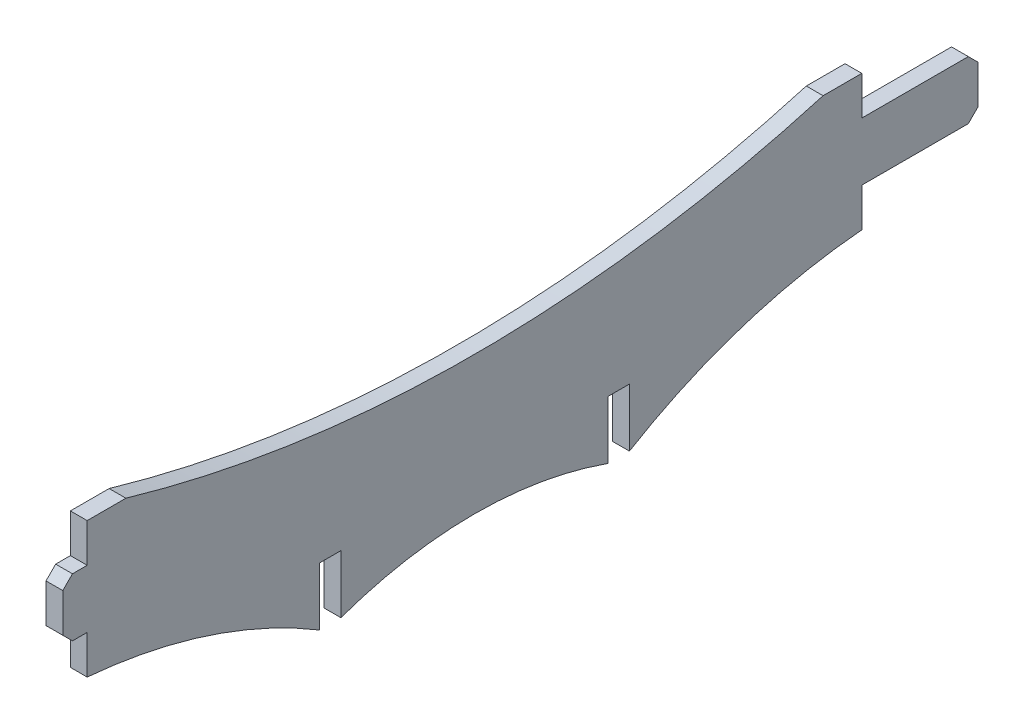
ISO-10303-21;
HEADER;
FILE_DESCRIPTION(('STEP AP214'),'2;1');
FILE_NAME('part.step','',(''),(''),'','','');
FILE_SCHEMA(('AUTOMOTIVE_DESIGN { 1 0 10303 214 1 1 1 1 }'));
ENDSEC;
DATA;
#1=APPLICATION_CONTEXT('core data for automotive mechanical design processes');
#2=APPLICATION_PROTOCOL_DEFINITION('international standard','automotive_design',2000,#1);
#3=PRODUCT_CONTEXT('',#1,'mechanical');
#4=PRODUCT('Part','Part','',(#3));
#5=PRODUCT_RELATED_PRODUCT_CATEGORY('part','',(#4));
#6=PRODUCT_DEFINITION_FORMATION('','',#4);
#7=PRODUCT_DEFINITION_CONTEXT('part definition',#1,'design');
#8=PRODUCT_DEFINITION('design','',#6,#7);
#9=PRODUCT_DEFINITION_SHAPE('','',#8);
#10=(LENGTH_UNIT() NAMED_UNIT(*) SI_UNIT(.MILLI.,.METRE.));
#11=(NAMED_UNIT(*) PLANE_ANGLE_UNIT() SI_UNIT($,.RADIAN.));
#12=(NAMED_UNIT(*) SI_UNIT($,.STERADIAN.) SOLID_ANGLE_UNIT());
#13=UNCERTAINTY_MEASURE_WITH_UNIT(LENGTH_MEASURE(1.E-05),#10,'distance_accuracy_value','');
#14=(GEOMETRIC_REPRESENTATION_CONTEXT(3) GLOBAL_UNCERTAINTY_ASSIGNED_CONTEXT((#13)) GLOBAL_UNIT_ASSIGNED_CONTEXT((#10,
#11,#12)) REPRESENTATION_CONTEXT('',''));
#15=CARTESIAN_POINT('',(0.,0.,0.));
#16=DIRECTION('',(0.,0.,1.));
#17=DIRECTION('',(1.,0.,0.));
#18=AXIS2_PLACEMENT_3D('',#15,#16,#17);
#19=CARTESIAN_POINT('',(2.75,0.,0.));
#20=DIRECTION('',(0.,-1.,0.));
#21=DIRECTION('',(0.,0.,-1.));
#22=AXIS2_PLACEMENT_3D('',#19,#20,#21);
#23=PLANE('',#22);
#24=DIRECTION('',(0.,0.,1.));
#25=VECTOR('',#24,1.);
#26=CARTESIAN_POINT('',(2.75,0.,0.));
#27=LINE('',#26,#25);
#28=CARTESIAN_POINT('',(2.75,0.,1.58750000000001));
#29=VERTEX_POINT('',#28);
#30=CARTESIAN_POINT('',(2.75,0.,19.05));
#31=VERTEX_POINT('',#30);
#32=EDGE_CURVE('E223',#29,#31,#27,.T.);
#33=ORIENTED_EDGE('',*,*,#32,.F.);
#34=DIRECTION('',(-1.,0.,0.));
#35=VECTOR('',#34,1.);
#36=CARTESIAN_POINT('',(2.75,0.,1.58750000000001));
#37=LINE('',#36,#35);
#38=CARTESIAN_POINT('',(0.,0.,1.58750000000001));
#39=VERTEX_POINT('',#38);
#40=EDGE_CURVE('E252',#29,#39,#37,.T.);
#41=ORIENTED_EDGE('',*,*,#40,.T.);
#42=DIRECTION('',(0.,0.,1.));
#43=VECTOR('',#42,1.);
#44=CARTESIAN_POINT('',(0.,0.,0.));
#45=LINE('',#44,#43);
#46=CARTESIAN_POINT('',(0.,0.,19.05));
#47=VERTEX_POINT('',#46);
#48=EDGE_CURVE('E249',#39,#47,#45,.T.);
#49=ORIENTED_EDGE('',*,*,#48,.T.);
#50=DIRECTION('',(-1.,0.,0.));
#51=VECTOR('',#50,1.);
#52=CARTESIAN_POINT('',(2.75,0.,19.05));
#53=LINE('',#52,#51);
#54=EDGE_CURVE('E241',#31,#47,#53,.T.);
#55=ORIENTED_EDGE('',*,*,#54,.F.);
#56=EDGE_LOOP('',(#33,#41,#49,#55));
#57=FACE_BOUND('',#56,.T.);
#58=ADVANCED_FACE('F47',(#57),#23,.F.);
#59=CARTESIAN_POINT('',(2.75,0.,19.05));
#60=DIRECTION('',(0.,0.,1.));
#61=DIRECTION('',(1.,0.,0.));
#62=AXIS2_PLACEMENT_3D('',#59,#60,#61);
#63=PLANE('',#62);
#64=DIRECTION('',(0.,1.,0.));
#65=VECTOR('',#64,1.);
#66=CARTESIAN_POINT('',(0.,0.,19.05));
#67=LINE('',#66,#65);
#68=CARTESIAN_POINT('',(0.,6.35,19.05));
#69=VERTEX_POINT('',#68);
#70=EDGE_CURVE('E458',#47,#69,#67,.T.);
#71=ORIENTED_EDGE('',*,*,#70,.T.);
#72=DIRECTION('',(-1.,0.,0.));
#73=VECTOR('',#72,1.);
#74=CARTESIAN_POINT('',(2.75,6.35,19.05));
#75=LINE('',#74,#73);
#76=CARTESIAN_POINT('',(2.75,6.35,19.05));
#77=VERTEX_POINT('',#76);
#78=EDGE_CURVE('E243',#77,#69,#75,.T.);
#79=ORIENTED_EDGE('',*,*,#78,.F.);
#80=DIRECTION('',(0.,1.,0.));
#81=VECTOR('',#80,1.);
#82=CARTESIAN_POINT('',(2.75,0.,19.05));
#83=LINE('',#82,#81);
#84=EDGE_CURVE('E227',#31,#77,#83,.T.);
#85=ORIENTED_EDGE('',*,*,#84,.F.);
#86=ORIENTED_EDGE('',*,*,#54,.T.);
#87=EDGE_LOOP('',(#71,#79,#85,#86));
#88=FACE_BOUND('',#87,.T.);
#89=ADVANCED_FACE('F240',(#88),#63,.F.);
#90=CARTESIAN_POINT('',(2.75,6.35,19.05));
#91=DIRECTION('',(0.,-1.,0.));
#92=DIRECTION('',(0.,0.,-1.));
#93=AXIS2_PLACEMENT_3D('',#90,#91,#92);
#94=PLANE('',#93);
#95=DIRECTION('',(0.,0.,1.));
#96=VECTOR('',#95,1.);
#97=CARTESIAN_POINT('',(0.,6.35,19.05));
#98=LINE('',#97,#96);
#99=CARTESIAN_POINT('',(0.,6.34999999999997,25.4000000000001));
#100=VERTEX_POINT('',#99);
#101=EDGE_CURVE('E450',#69,#100,#98,.T.);
#102=ORIENTED_EDGE('',*,*,#101,.T.);
#103=DIRECTION('',(-1.,0.,0.));
#104=VECTOR('',#103,1.);
#105=CARTESIAN_POINT('',(2.75,6.34999999999997,25.4000000000001));
#106=LINE('',#105,#104);
#107=CARTESIAN_POINT('',(2.75,6.34999999999997,25.4000000000001));
#108=VERTEX_POINT('',#107);
#109=EDGE_CURVE('E258',#108,#100,#106,.T.);
#110=ORIENTED_EDGE('',*,*,#109,.F.);
#111=DIRECTION('',(0.,0.,1.));
#112=VECTOR('',#111,1.);
#113=CARTESIAN_POINT('',(2.75,6.35,19.05));
#114=LINE('',#113,#112);
#115=EDGE_CURVE('E246',#77,#108,#114,.T.);
#116=ORIENTED_EDGE('',*,*,#115,.F.);
#117=ORIENTED_EDGE('',*,*,#78,.T.);
#118=EDGE_LOOP('',(#102,#110,#116,#117));
#119=FACE_BOUND('',#118,.T.);
#120=ADVANCED_FACE('F522',(#119),#94,.F.);
#121=CARTESIAN_POINT('',(2.75,202.38569137789,82.5500000000001));
#122=DIRECTION('',(-1.,0.,0.));
#123=DIRECTION('',(0.,0.,1.));
#124=AXIS2_PLACEMENT_3D('',#121,#122,#123);
#125=CYLINDRICAL_SURFACE('',#124,204.196265377228);
#126=CARTESIAN_POINT('',(0.,202.38569137789,82.5500000000001));
#127=DIRECTION('',(-1.,0.,0.));
#128=DIRECTION('',(0.,0.,-1.));
#129=AXIS2_PLACEMENT_3D('',#126,#127,#128);
#130=CIRCLE('',#129,204.196265377228);
#131=CARTESIAN_POINT('',(0.,6.34999999999997,139.7));
#132=VERTEX_POINT('',#131);
#133=EDGE_CURVE('E445',#100,#132,#130,.T.);
#134=ORIENTED_EDGE('',*,*,#133,.T.);
#135=DIRECTION('',(-1.,0.,0.));
#136=VECTOR('',#135,1.);
#137=CARTESIAN_POINT('',(2.75,6.34999999999997,139.7));
#138=LINE('',#137,#136);
#139=CARTESIAN_POINT('',(2.75,6.34999999999997,139.7));
#140=VERTEX_POINT('',#139);
#141=EDGE_CURVE('E434',#140,#132,#138,.T.);
#142=ORIENTED_EDGE('',*,*,#141,.F.);
#143=CARTESIAN_POINT('',(2.75,202.38569137789,82.5500000000001));
#144=DIRECTION('',(-1.,0.,0.));
#145=DIRECTION('',(0.,0.,-1.));
#146=AXIS2_PLACEMENT_3D('',#143,#144,#145);
#147=CIRCLE('',#146,204.196265377228);
#148=EDGE_CURVE('E446',#108,#140,#147,.T.);
#149=ORIENTED_EDGE('',*,*,#148,.F.);
#150=ORIENTED_EDGE('',*,*,#109,.T.);
#151=EDGE_LOOP('',(#134,#142,#149,#150));
#152=FACE_BOUND('',#151,.T.);
#153=ADVANCED_FACE('F443',(#152),#125,.F.);
#154=CARTESIAN_POINT('',(2.75,6.34999999999997,146.05));
#155=DIRECTION('',(0.,-1.,0.));
#156=DIRECTION('',(0.,0.,-1.));
#157=AXIS2_PLACEMENT_3D('',#154,#155,#156);
#158=PLANE('',#157);
#159=DIRECTION('',(0.,0.,1.));
#160=VECTOR('',#159,1.);
#161=CARTESIAN_POINT('',(0.,6.34999999999997,146.05));
#162=LINE('',#161,#160);
#163=CARTESIAN_POINT('',(0.,6.34999999999997,146.05));
#164=VERTEX_POINT('',#163);
#165=EDGE_CURVE('E452',#132,#164,#162,.T.);
#166=ORIENTED_EDGE('',*,*,#165,.T.);
#167=DIRECTION('',(-1.,0.,0.));
#168=VECTOR('',#167,1.);
#169=CARTESIAN_POINT('',(2.75,6.34999999999997,146.05));
#170=LINE('',#169,#168);
#171=CARTESIAN_POINT('',(2.75,6.34999999999997,146.05));
#172=VERTEX_POINT('',#171);
#173=EDGE_CURVE('E430',#172,#164,#170,.T.);
#174=ORIENTED_EDGE('',*,*,#173,.F.);
#175=DIRECTION('',(0.,0.,1.));
#176=VECTOR('',#175,1.);
#177=CARTESIAN_POINT('',(2.75,6.34999999999997,146.05));
#178=LINE('',#177,#176);
#179=EDGE_CURVE('E468',#140,#172,#178,.T.);
#180=ORIENTED_EDGE('',*,*,#179,.F.);
#181=ORIENTED_EDGE('',*,*,#141,.T.);
#182=EDGE_LOOP('',(#166,#174,#180,#181));
#183=FACE_BOUND('',#182,.T.);
#184=ADVANCED_FACE('F467',(#183),#158,.F.);
#185=CARTESIAN_POINT('',(2.75,0.,146.05));
#186=DIRECTION('',(0.,0.,-1.));
#187=DIRECTION('',(-1.,0.,0.));
#188=AXIS2_PLACEMENT_3D('',#185,#186,#187);
#189=PLANE('',#188);
#190=DIRECTION('',(0.,-1.,0.));
#191=VECTOR('',#190,1.);
#192=CARTESIAN_POINT('',(0.,0.,146.05));
#193=LINE('',#192,#191);
#194=CARTESIAN_POINT('',(0.,0.,146.05));
#195=VERTEX_POINT('',#194);
#196=EDGE_CURVE('E336',#164,#195,#193,.T.);
#197=ORIENTED_EDGE('',*,*,#196,.T.);
#198=DIRECTION('',(-1.,0.,0.));
#199=VECTOR('',#198,1.);
#200=CARTESIAN_POINT('',(2.75,0.,146.05));
#201=LINE('',#200,#199);
#202=CARTESIAN_POINT('',(2.75,0.,146.05));
#203=VERTEX_POINT('',#202);
#204=EDGE_CURVE('E427',#203,#195,#201,.T.);
#205=ORIENTED_EDGE('',*,*,#204,.F.);
#206=DIRECTION('',(0.,-1.,0.));
#207=VECTOR('',#206,1.);
#208=CARTESIAN_POINT('',(2.75,0.,146.05));
#209=LINE('',#208,#207);
#210=EDGE_CURVE('E313',#172,#203,#209,.T.);
#211=ORIENTED_EDGE('',*,*,#210,.F.);
#212=ORIENTED_EDGE('',*,*,#173,.T.);
#213=EDGE_LOOP('',(#197,#205,#211,#212));
#214=FACE_BOUND('',#213,.T.);
#215=ADVANCED_FACE('F463',(#214),#189,.F.);
#216=CARTESIAN_POINT('',(2.75,0.,146.05));
#217=DIRECTION('',(0.,-1.,0.));
#218=DIRECTION('',(0.,0.,-1.));
#219=AXIS2_PLACEMENT_3D('',#216,#217,#218);
#220=PLANE('',#219);
#221=DIRECTION('',(0.,0.,1.));
#222=VECTOR('',#221,1.);
#223=CARTESIAN_POINT('',(0.,0.,146.05));
#224=LINE('',#223,#222);
#225=CARTESIAN_POINT('',(0.,0.,148.4625));
#226=VERTEX_POINT('',#225);
#227=EDGE_CURVE('E308',#195,#226,#224,.T.);
#228=ORIENTED_EDGE('',*,*,#227,.T.);
#229=DIRECTION('',(1.,0.,0.));
#230=VECTOR('',#229,1.);
#231=CARTESIAN_POINT('',(2.75,0.,148.4625));
#232=LINE('',#231,#230);
#233=CARTESIAN_POINT('',(2.75,0.,148.4625));
#234=VERTEX_POINT('',#233);
#235=EDGE_CURVE('E57',#226,#234,#232,.T.);
#236=ORIENTED_EDGE('',*,*,#235,.T.);
#237=DIRECTION('',(0.,0.,1.));
#238=VECTOR('',#237,1.);
#239=CARTESIAN_POINT('',(2.75,0.,146.05));
#240=LINE('',#239,#238);
#241=EDGE_CURVE('E306',#203,#234,#240,.T.);
#242=ORIENTED_EDGE('',*,*,#241,.F.);
#243=ORIENTED_EDGE('',*,*,#204,.T.);
#244=EDGE_LOOP('',(#228,#236,#242,#243));
#245=FACE_BOUND('',#244,.T.);
#246=ADVANCED_FACE('F304',(#245),#220,.F.);
#247=CARTESIAN_POINT('',(2.75,-9.52500000000001,150.05));
#248=DIRECTION('',(0.,0.,-1.));
#249=DIRECTION('',(-1.,0.,0.));
#250=AXIS2_PLACEMENT_3D('',#247,#248,#249);
#251=PLANE('',#250);
#252=DIRECTION('',(0.,-1.,0.));
#253=VECTOR('',#252,1.);
#254=CARTESIAN_POINT('',(2.75,-9.52500000000001,150.05));
#255=LINE('',#254,#253);
#256=CARTESIAN_POINT('',(2.75,-1.58750000000002,150.05));
#257=VERTEX_POINT('',#256);
#258=CARTESIAN_POINT('',(2.75,-7.93750000000003,150.05));
#259=VERTEX_POINT('',#258);
#260=EDGE_CURVE('E316',#257,#259,#255,.T.);
#261=ORIENTED_EDGE('',*,*,#260,.F.);
#262=DIRECTION('',(-1.,0.,0.));
#263=VECTOR('',#262,1.);
#264=CARTESIAN_POINT('',(2.75,-1.58750000000001,150.05));
#265=LINE('',#264,#263);
#266=CARTESIAN_POINT('',(0.,-1.58750000000002,150.05));
#267=VERTEX_POINT('',#266);
#268=EDGE_CURVE('E295',#257,#267,#265,.T.);
#269=ORIENTED_EDGE('',*,*,#268,.T.);
#270=DIRECTION('',(0.,-1.,0.));
#271=VECTOR('',#270,1.);
#272=CARTESIAN_POINT('',(0.,-9.52500000000001,150.05));
#273=LINE('',#272,#271);
#274=CARTESIAN_POINT('',(0.,-7.93750000000003,150.05));
#275=VERTEX_POINT('',#274);
#276=EDGE_CURVE('E324',#267,#275,#273,.T.);
#277=ORIENTED_EDGE('',*,*,#276,.T.);
#278=DIRECTION('',(1.,0.,0.));
#279=VECTOR('',#278,1.);
#280=CARTESIAN_POINT('',(2.75,-7.93750000000003,150.05));
#281=LINE('',#280,#279);
#282=EDGE_CURVE('E292',#275,#259,#281,.T.);
#283=ORIENTED_EDGE('',*,*,#282,.T.);
#284=EDGE_LOOP('',(#261,#269,#277,#283));
#285=FACE_BOUND('',#284,.T.);
#286=ADVANCED_FACE('F323',(#285),#251,.F.);
#287=CARTESIAN_POINT('',(2.75,-9.52500000000004,146.05));
#288=DIRECTION('',(0.,1.,0.));
#289=DIRECTION('',(0.,0.,1.));
#290=AXIS2_PLACEMENT_3D('',#287,#288,#289);
#291=PLANE('',#290);
#292=DIRECTION('',(0.,0.,-1.));
#293=VECTOR('',#292,1.);
#294=CARTESIAN_POINT('',(2.75,-9.52500000000004,146.05));
#295=LINE('',#294,#293);
#296=CARTESIAN_POINT('',(2.75,-9.52500000000002,148.4625));
#297=VERTEX_POINT('',#296);
#298=CARTESIAN_POINT('',(2.75,-9.52500000000004,146.05));
#299=VERTEX_POINT('',#298);
#300=EDGE_CURVE('E479',#297,#299,#295,.T.);
#301=ORIENTED_EDGE('',*,*,#300,.F.);
#302=DIRECTION('',(-1.,0.,0.));
#303=VECTOR('',#302,1.);
#304=CARTESIAN_POINT('',(2.75,-9.52500000000002,148.4625));
#305=LINE('',#304,#303);
#306=CARTESIAN_POINT('',(0.,-9.52500000000002,148.4625));
#307=VERTEX_POINT('',#306);
#308=EDGE_CURVE('E11',#297,#307,#305,.T.);
#309=ORIENTED_EDGE('',*,*,#308,.T.);
#310=DIRECTION('',(0.,0.,-1.));
#311=VECTOR('',#310,1.);
#312=CARTESIAN_POINT('',(0.,-9.52500000000004,146.05));
#313=LINE('',#312,#311);
#314=CARTESIAN_POINT('',(0.,-9.52500000000004,146.05));
#315=VERTEX_POINT('',#314);
#316=EDGE_CURVE('E330',#307,#315,#313,.T.);
#317=ORIENTED_EDGE('',*,*,#316,.T.);
#318=DIRECTION('',(-1.,0.,0.));
#319=VECTOR('',#318,1.);
#320=CARTESIAN_POINT('',(2.75,-9.52500000000004,146.05));
#321=LINE('',#320,#319);
#322=EDGE_CURVE('E423',#299,#315,#321,.T.);
#323=ORIENTED_EDGE('',*,*,#322,.F.);
#324=EDGE_LOOP('',(#301,#309,#317,#323));
#325=FACE_BOUND('',#324,.T.);
#326=ADVANCED_FACE('F564',(#325),#291,.F.);
#327=CARTESIAN_POINT('',(2.75,-15.875,146.05));
#328=DIRECTION('',(0.,0.,-1.));
#329=DIRECTION('',(-1.,0.,0.));
#330=AXIS2_PLACEMENT_3D('',#327,#328,#329);
#331=PLANE('',#330);
#332=DIRECTION('',(0.,-1.,0.));
#333=VECTOR('',#332,1.);
#334=CARTESIAN_POINT('',(0.,-15.875,146.05));
#335=LINE('',#334,#333);
#336=CARTESIAN_POINT('',(0.,-15.875,146.05));
#337=VERTEX_POINT('',#336);
#338=EDGE_CURVE('E334',#315,#337,#335,.T.);
#339=ORIENTED_EDGE('',*,*,#338,.T.);
#340=DIRECTION('',(-1.,0.,0.));
#341=VECTOR('',#340,1.);
#342=CARTESIAN_POINT('',(2.75,-15.875,146.05));
#343=LINE('',#342,#341);
#344=CARTESIAN_POINT('',(2.75,-15.875,146.05));
#345=VERTEX_POINT('',#344);
#346=EDGE_CURVE('E419',#345,#337,#343,.T.);
#347=ORIENTED_EDGE('',*,*,#346,.F.);
#348=DIRECTION('',(0.,-1.,0.));
#349=VECTOR('',#348,1.);
#350=CARTESIAN_POINT('',(2.75,-15.875,146.05));
#351=LINE('',#350,#349);
#352=EDGE_CURVE('E482',#299,#345,#351,.T.);
#353=ORIENTED_EDGE('',*,*,#352,.F.);
#354=ORIENTED_EDGE('',*,*,#322,.T.);
#355=EDGE_LOOP('',(#339,#347,#353,#354));
#356=FACE_BOUND('',#355,.T.);
#357=ADVANCED_FACE('F571',(#356),#331,.F.);
#358=CARTESIAN_POINT('',(2.75,-104.13430356491,153.640567519954));
#359=DIRECTION('',(-1.,0.,0.));
#360=DIRECTION('',(0.,0.,1.));
#361=AXIS2_PLACEMENT_3D('',#358,#359,#360);
#362=CYLINDRICAL_SURFACE('',#361,88.5851081222908);
#363=CARTESIAN_POINT('',(0.,-104.13430356491,153.640567519954));
#364=DIRECTION('',(-1.,0.,0.));
#365=DIRECTION('',(0.,0.,1.));
#366=AXIS2_PLACEMENT_3D('',#363,#364,#365);
#367=CIRCLE('',#366,88.5851081222908);
#368=CARTESIAN_POINT('',(0.,-28.2416595159482,107.95));
#369=VERTEX_POINT('',#368);
#370=EDGE_CURVE('E342',#337,#369,#367,.T.);
#371=ORIENTED_EDGE('',*,*,#370,.T.);
#372=DIRECTION('',(-1.,0.,0.));
#373=VECTOR('',#372,1.);
#374=CARTESIAN_POINT('',(2.75,-28.2416595159482,107.95));
#375=LINE('',#374,#373);
#376=CARTESIAN_POINT('',(2.75,-28.2416595159482,107.95));
#377=VERTEX_POINT('',#376);
#378=EDGE_CURVE('E415',#377,#369,#375,.T.);
#379=ORIENTED_EDGE('',*,*,#378,.F.);
#380=CARTESIAN_POINT('',(2.75,-104.13430356491,153.640567519954));
#381=DIRECTION('',(-1.,0.,0.));
#382=DIRECTION('',(0.,0.,1.));
#383=AXIS2_PLACEMENT_3D('',#380,#381,#382);
#384=CIRCLE('',#383,88.5851081222908);
#385=EDGE_CURVE('E485',#345,#377,#384,.T.);
#386=ORIENTED_EDGE('',*,*,#385,.F.);
#387=ORIENTED_EDGE('',*,*,#346,.T.);
#388=EDGE_LOOP('',(#371,#379,#386,#387));
#389=FACE_BOUND('',#388,.T.);
#390=ADVANCED_FACE('F575',(#389),#362,.F.);
#391=CARTESIAN_POINT('',(2.75,-18.7166595159482,107.95));
#392=DIRECTION('',(0.,0.,1.));
#393=DIRECTION('',(1.,0.,0.));
#394=AXIS2_PLACEMENT_3D('',#391,#392,#393);
#395=PLANE('',#394);
#396=DIRECTION('',(0.,1.,0.));
#397=VECTOR('',#396,1.);
#398=CARTESIAN_POINT('',(0.,-18.7166595159482,107.95));
#399=LINE('',#398,#397);
#400=CARTESIAN_POINT('',(0.,-18.7166595159482,107.95));
#401=VERTEX_POINT('',#400);
#402=EDGE_CURVE('E345',#369,#401,#399,.T.);
#403=ORIENTED_EDGE('',*,*,#402,.T.);
#404=DIRECTION('',(-1.,0.,0.));
#405=VECTOR('',#404,1.);
#406=CARTESIAN_POINT('',(2.75,-18.7166595159482,107.95));
#407=LINE('',#406,#405);
#408=CARTESIAN_POINT('',(2.75,-18.7166595159482,107.95));
#409=VERTEX_POINT('',#408);
#410=EDGE_CURVE('E411',#409,#401,#407,.T.);
#411=ORIENTED_EDGE('',*,*,#410,.F.);
#412=DIRECTION('',(0.,1.,0.));
#413=VECTOR('',#412,1.);
#414=CARTESIAN_POINT('',(2.75,-18.7166595159482,107.95));
#415=LINE('',#414,#413);
#416=EDGE_CURVE('E488',#377,#409,#415,.T.);
#417=ORIENTED_EDGE('',*,*,#416,.F.);
#418=ORIENTED_EDGE('',*,*,#378,.T.);
#419=EDGE_LOOP('',(#403,#411,#417,#418));
#420=FACE_BOUND('',#419,.T.);
#421=ADVANCED_FACE('F582',(#420),#395,.F.);
#422=CARTESIAN_POINT('',(2.75,-18.7166595159482,107.95));
#423=DIRECTION('',(0.,1.,0.));
#424=DIRECTION('',(0.,0.,1.));
#425=AXIS2_PLACEMENT_3D('',#422,#423,#424);
#426=PLANE('',#425);
#427=DIRECTION('',(0.,0.,-1.));
#428=VECTOR('',#427,1.);
#429=CARTESIAN_POINT('',(0.,-18.7166595159482,107.95));
#430=LINE('',#429,#428);
#431=CARTESIAN_POINT('',(0.,-18.7166595159482,104.45));
#432=VERTEX_POINT('',#431);
#433=EDGE_CURVE('E348',#401,#432,#430,.T.);
#434=ORIENTED_EDGE('',*,*,#433,.T.);
#435=DIRECTION('',(-1.,0.,0.));
#436=VECTOR('',#435,1.);
#437=CARTESIAN_POINT('',(2.75,-18.7166595159482,104.45));
#438=LINE('',#437,#436);
#439=CARTESIAN_POINT('',(2.75,-18.7166595159482,104.45));
#440=VERTEX_POINT('',#439);
#441=EDGE_CURVE('E407',#440,#432,#438,.T.);
#442=ORIENTED_EDGE('',*,*,#441,.F.);
#443=DIRECTION('',(0.,0.,-1.));
#444=VECTOR('',#443,1.);
#445=CARTESIAN_POINT('',(2.75,-18.7166595159482,107.95));
#446=LINE('',#445,#444);
#447=EDGE_CURVE('E491',#409,#440,#446,.T.);
#448=ORIENTED_EDGE('',*,*,#447,.F.);
#449=ORIENTED_EDGE('',*,*,#410,.T.);
#450=EDGE_LOOP('',(#434,#442,#448,#449));
#451=FACE_BOUND('',#450,.T.);
#452=ADVANCED_FACE('F585',(#451),#426,.F.);
#453=CARTESIAN_POINT('',(2.75,-18.7166595159482,104.45));
#454=DIRECTION('',(0.,0.,-1.));
#455=DIRECTION('',(-1.,0.,0.));
#456=AXIS2_PLACEMENT_3D('',#453,#454,#455);
#457=PLANE('',#456);
#458=DIRECTION('',(0.,-1.,0.));
#459=VECTOR('',#458,1.);
#460=CARTESIAN_POINT('',(0.,-18.7166595159482,104.45));
#461=LINE('',#460,#459);
#462=CARTESIAN_POINT('',(0.,-28.2416595159482,104.45));
#463=VERTEX_POINT('',#462);
#464=EDGE_CURVE('E351',#432,#463,#461,.T.);
#465=ORIENTED_EDGE('',*,*,#464,.T.);
#466=DIRECTION('',(-1.,0.,0.));
#467=VECTOR('',#466,1.);
#468=CARTESIAN_POINT('',(2.75,-28.2416595159482,104.45));
#469=LINE('',#468,#467);
#470=CARTESIAN_POINT('',(2.75,-28.2416595159482,104.45));
#471=VERTEX_POINT('',#470);
#472=EDGE_CURVE('E403',#471,#463,#469,.T.);
#473=ORIENTED_EDGE('',*,*,#472,.F.);
#474=DIRECTION('',(0.,-1.,0.));
#475=VECTOR('',#474,1.);
#476=CARTESIAN_POINT('',(2.75,-18.7166595159482,104.45));
#477=LINE('',#476,#475);
#478=EDGE_CURVE('E494',#440,#471,#477,.T.);
#479=ORIENTED_EDGE('',*,*,#478,.F.);
#480=ORIENTED_EDGE('',*,*,#441,.T.);
#481=EDGE_LOOP('',(#465,#473,#479,#480));
#482=FACE_BOUND('',#481,.T.);
#483=ADVANCED_FACE('F590',(#482),#457,.F.);
#484=CARTESIAN_POINT('',(2.75,-89.5005247152407,82.55));
#485=DIRECTION('',(-1.,0.,0.));
#486=DIRECTION('',(0.,0.,1.));
#487=AXIS2_PLACEMENT_3D('',#484,#485,#486);
#488=CYLINDRICAL_SURFACE('',#487,65.0558111586128);
#489=CARTESIAN_POINT('',(0.,-89.5005247152407,82.55));
#490=DIRECTION('',(-1.,0.,0.));
#491=DIRECTION('',(0.,0.,1.));
#492=AXIS2_PLACEMENT_3D('',#489,#490,#491);
#493=CIRCLE('',#492,65.0558111586128);
#494=CARTESIAN_POINT('',(0.,-28.2416595159482,60.65));
#495=VERTEX_POINT('',#494);
#496=EDGE_CURVE('E354',#463,#495,#493,.T.);
#497=ORIENTED_EDGE('',*,*,#496,.T.);
#498=DIRECTION('',(-1.,0.,0.));
#499=VECTOR('',#498,1.);
#500=CARTESIAN_POINT('',(2.75,-28.2416595159482,60.65));
#501=LINE('',#500,#499);
#502=CARTESIAN_POINT('',(2.75,-28.2416595159482,60.65));
#503=VERTEX_POINT('',#502);
#504=EDGE_CURVE('E399',#503,#495,#501,.T.);
#505=ORIENTED_EDGE('',*,*,#504,.F.);
#506=CARTESIAN_POINT('',(2.75,-89.5005247152407,82.55));
#507=DIRECTION('',(-1.,0.,0.));
#508=DIRECTION('',(0.,0.,1.));
#509=AXIS2_PLACEMENT_3D('',#506,#507,#508);
#510=CIRCLE('',#509,65.0558111586128);
#511=EDGE_CURVE('E497',#471,#503,#510,.T.);
#512=ORIENTED_EDGE('',*,*,#511,.F.);
#513=ORIENTED_EDGE('',*,*,#472,.T.);
#514=EDGE_LOOP('',(#497,#505,#512,#513));
#515=FACE_BOUND('',#514,.T.);
#516=ADVANCED_FACE('F596',(#515),#488,.F.);
#517=CARTESIAN_POINT('',(2.75,-18.7166595159482,60.65));
#518=DIRECTION('',(0.,0.,1.));
#519=DIRECTION('',(1.,0.,0.));
#520=AXIS2_PLACEMENT_3D('',#517,#518,#519);
#521=PLANE('',#520);
#522=DIRECTION('',(0.,1.,0.));
#523=VECTOR('',#522,1.);
#524=CARTESIAN_POINT('',(0.,-18.7166595159482,60.65));
#525=LINE('',#524,#523);
#526=CARTESIAN_POINT('',(0.,-18.7166595159482,60.65));
#527=VERTEX_POINT('',#526);
#528=EDGE_CURVE('E357',#495,#527,#525,.T.);
#529=ORIENTED_EDGE('',*,*,#528,.T.);
#530=DIRECTION('',(-1.,0.,0.));
#531=VECTOR('',#530,1.);
#532=CARTESIAN_POINT('',(2.75,-18.7166595159482,60.65));
#533=LINE('',#532,#531);
#534=CARTESIAN_POINT('',(2.75,-18.7166595159482,60.65));
#535=VERTEX_POINT('',#534);
#536=EDGE_CURVE('E395',#535,#527,#533,.T.);
#537=ORIENTED_EDGE('',*,*,#536,.F.);
#538=DIRECTION('',(0.,1.,0.));
#539=VECTOR('',#538,1.);
#540=CARTESIAN_POINT('',(2.75,-18.7166595159482,60.65));
#541=LINE('',#540,#539);
#542=EDGE_CURVE('E500',#503,#535,#541,.T.);
#543=ORIENTED_EDGE('',*,*,#542,.F.);
#544=ORIENTED_EDGE('',*,*,#504,.T.);
#545=EDGE_LOOP('',(#529,#537,#543,#544));
#546=FACE_BOUND('',#545,.T.);
#547=ADVANCED_FACE('F600',(#546),#521,.F.);
#548=CARTESIAN_POINT('',(2.75,-18.7166595159482,57.15));
#549=DIRECTION('',(0.,1.,0.));
#550=DIRECTION('',(0.,0.,1.));
#551=AXIS2_PLACEMENT_3D('',#548,#549,#550);
#552=PLANE('',#551);
#553=DIRECTION('',(0.,0.,-1.));
#554=VECTOR('',#553,1.);
#555=CARTESIAN_POINT('',(0.,-18.7166595159482,57.15));
#556=LINE('',#555,#554);
#557=CARTESIAN_POINT('',(0.,-18.7166595159482,57.15));
#558=VERTEX_POINT('',#557);
#559=EDGE_CURVE('E360',#527,#558,#556,.T.);
#560=ORIENTED_EDGE('',*,*,#559,.T.);
#561=DIRECTION('',(-1.,0.,0.));
#562=VECTOR('',#561,1.);
#563=CARTESIAN_POINT('',(2.75,-18.7166595159482,57.15));
#564=LINE('',#563,#562);
#565=CARTESIAN_POINT('',(2.75,-18.7166595159482,57.15));
#566=VERTEX_POINT('',#565);
#567=EDGE_CURVE('E391',#566,#558,#564,.T.);
#568=ORIENTED_EDGE('',*,*,#567,.F.);
#569=DIRECTION('',(0.,0.,-1.));
#570=VECTOR('',#569,1.);
#571=CARTESIAN_POINT('',(2.75,-18.7166595159482,57.15));
#572=LINE('',#571,#570);
#573=EDGE_CURVE('E503',#535,#566,#572,.T.);
#574=ORIENTED_EDGE('',*,*,#573,.F.);
#575=ORIENTED_EDGE('',*,*,#536,.T.);
#576=EDGE_LOOP('',(#560,#568,#574,#575));
#577=FACE_BOUND('',#576,.T.);
#578=ADVANCED_FACE('F605',(#577),#552,.F.);
#579=CARTESIAN_POINT('',(2.75,-18.7166595159482,57.15));
#580=DIRECTION('',(0.,0.,-1.));
#581=DIRECTION('',(-1.,0.,0.));
#582=AXIS2_PLACEMENT_3D('',#579,#580,#581);
#583=PLANE('',#582);
#584=DIRECTION('',(0.,-1.,0.));
#585=VECTOR('',#584,1.);
#586=CARTESIAN_POINT('',(0.,-18.7166595159482,57.15));
#587=LINE('',#586,#585);
#588=CARTESIAN_POINT('',(0.,-28.2416595159482,57.15));
#589=VERTEX_POINT('',#588);
#590=EDGE_CURVE('E363',#558,#589,#587,.T.);
#591=ORIENTED_EDGE('',*,*,#590,.T.);
#592=DIRECTION('',(-1.,0.,0.));
#593=VECTOR('',#592,1.);
#594=CARTESIAN_POINT('',(2.75,-28.2416595159482,57.15));
#595=LINE('',#594,#593);
#596=CARTESIAN_POINT('',(2.75,-28.2416595159482,57.15));
#597=VERTEX_POINT('',#596);
#598=EDGE_CURVE('E387',#597,#589,#595,.T.);
#599=ORIENTED_EDGE('',*,*,#598,.F.);
#600=DIRECTION('',(0.,-1.,0.));
#601=VECTOR('',#600,1.);
#602=CARTESIAN_POINT('',(2.75,-18.7166595159482,57.15));
#603=LINE('',#602,#601);
#604=EDGE_CURVE('E506',#566,#597,#603,.T.);
#605=ORIENTED_EDGE('',*,*,#604,.F.);
#606=ORIENTED_EDGE('',*,*,#567,.T.);
#607=EDGE_LOOP('',(#591,#599,#605,#606));
#608=FACE_BOUND('',#607,.T.);
#609=ADVANCED_FACE('F611',(#608),#583,.F.);
#610=CARTESIAN_POINT('',(2.75,-104.13430356491,11.4594324800457));
#611=DIRECTION('',(-1.,0.,0.));
#612=DIRECTION('',(0.,0.,1.));
#613=AXIS2_PLACEMENT_3D('',#610,#611,#612);
#614=CYLINDRICAL_SURFACE('',#613,88.5851081222908);
#615=CARTESIAN_POINT('',(0.,-104.13430356491,11.4594324800457));
#616=DIRECTION('',(-1.,0.,0.));
#617=DIRECTION('',(0.,0.,-1.));
#618=AXIS2_PLACEMENT_3D('',#615,#616,#617);
#619=CIRCLE('',#618,88.5851081222908);
#620=CARTESIAN_POINT('',(0.,-15.875,19.05));
#621=VERTEX_POINT('',#620);
#622=EDGE_CURVE('E366',#589,#621,#619,.T.);
#623=ORIENTED_EDGE('',*,*,#622,.T.);
#624=DIRECTION('',(-1.,0.,0.));
#625=VECTOR('',#624,1.);
#626=CARTESIAN_POINT('',(2.75,-15.875,19.05));
#627=LINE('',#626,#625);
#628=CARTESIAN_POINT('',(2.75,-15.875,19.05));
#629=VERTEX_POINT('',#628);
#630=EDGE_CURVE('E382',#629,#621,#627,.T.);
#631=ORIENTED_EDGE('',*,*,#630,.F.);
#632=CARTESIAN_POINT('',(2.75,-104.13430356491,11.4594324800457));
#633=DIRECTION('',(-1.,0.,0.));
#634=DIRECTION('',(0.,0.,-1.));
#635=AXIS2_PLACEMENT_3D('',#632,#633,#634);
#636=CIRCLE('',#635,88.5851081222908);
#637=EDGE_CURVE('E509',#597,#629,#636,.T.);
#638=ORIENTED_EDGE('',*,*,#637,.F.);
#639=ORIENTED_EDGE('',*,*,#598,.T.);
#640=EDGE_LOOP('',(#623,#631,#638,#639));
#641=FACE_BOUND('',#640,.T.);
#642=ADVANCED_FACE('F615',(#641),#614,.F.);
#643=CARTESIAN_POINT('',(2.75,-9.525,19.05));
#644=DIRECTION('',(0.,0.,1.));
#645=DIRECTION('',(1.,0.,0.));
#646=AXIS2_PLACEMENT_3D('',#643,#644,#645);
#647=PLANE('',#646);
#648=DIRECTION('',(0.,1.,0.));
#649=VECTOR('',#648,1.);
#650=CARTESIAN_POINT('',(0.,-9.525,19.05));
#651=LINE('',#650,#649);
#652=CARTESIAN_POINT('',(0.,-9.525,19.05));
#653=VERTEX_POINT('',#652);
#654=EDGE_CURVE('E369',#621,#653,#651,.T.);
#655=ORIENTED_EDGE('',*,*,#654,.T.);
#656=DIRECTION('',(-1.,0.,0.));
#657=VECTOR('',#656,1.);
#658=CARTESIAN_POINT('',(2.75,-9.525,19.05));
#659=LINE('',#658,#657);
#660=CARTESIAN_POINT('',(2.75,-9.525,19.05));
#661=VERTEX_POINT('',#660);
#662=EDGE_CURVE('E378',#661,#653,#659,.T.);
#663=ORIENTED_EDGE('',*,*,#662,.F.);
#664=DIRECTION('',(0.,1.,0.));
#665=VECTOR('',#664,1.);
#666=CARTESIAN_POINT('',(2.75,-9.525,19.05));
#667=LINE('',#666,#665);
#668=EDGE_CURVE('E512',#629,#661,#667,.T.);
#669=ORIENTED_EDGE('',*,*,#668,.F.);
#670=ORIENTED_EDGE('',*,*,#630,.T.);
#671=EDGE_LOOP('',(#655,#663,#669,#670));
#672=FACE_BOUND('',#671,.T.);
#673=ADVANCED_FACE('F620',(#672),#647,.F.);
#674=CARTESIAN_POINT('',(2.75,-9.525,0.));
#675=DIRECTION('',(0.,1.,0.));
#676=DIRECTION('',(0.,0.,1.));
#677=AXIS2_PLACEMENT_3D('',#674,#675,#676);
#678=PLANE('',#677);
#679=DIRECTION('',(0.,0.,-1.));
#680=VECTOR('',#679,1.);
#681=CARTESIAN_POINT('',(0.,-9.525,0.));
#682=LINE('',#681,#680);
#683=CARTESIAN_POINT('',(0.,-9.525,1.58750000000003));
#684=VERTEX_POINT('',#683);
#685=EDGE_CURVE('E372',#653,#684,#682,.T.);
#686=ORIENTED_EDGE('',*,*,#685,.T.);
#687=DIRECTION('',(1.,0.,0.));
#688=VECTOR('',#687,1.);
#689=CARTESIAN_POINT('',(2.75,-9.525,1.58750000000003));
#690=LINE('',#689,#688);
#691=CARTESIAN_POINT('',(2.75,-9.525,1.58750000000003));
#692=VERTEX_POINT('',#691);
#693=EDGE_CURVE('E64',#684,#692,#690,.T.);
#694=ORIENTED_EDGE('',*,*,#693,.T.);
#695=DIRECTION('',(0.,0.,-1.));
#696=VECTOR('',#695,1.);
#697=CARTESIAN_POINT('',(2.75,-9.525,0.));
#698=LINE('',#697,#696);
#699=EDGE_CURVE('E515',#661,#692,#698,.T.);
#700=ORIENTED_EDGE('',*,*,#699,.F.);
#701=ORIENTED_EDGE('',*,*,#662,.T.);
#702=EDGE_LOOP('',(#686,#694,#700,#701));
#703=FACE_BOUND('',#702,.T.);
#704=ADVANCED_FACE('F629',(#703),#678,.F.);
#705=CARTESIAN_POINT('',(2.75,0.,0.));
#706=DIRECTION('',(0.,0.,1.));
#707=DIRECTION('',(0.,-1.,0.));
#708=AXIS2_PLACEMENT_3D('',#705,#706,#707);
#709=PLANE('',#708);
#710=DIRECTION('',(0.,1.,0.));
#711=VECTOR('',#710,1.);
#712=CARTESIAN_POINT('',(0.,0.,0.));
#713=LINE('',#712,#711);
#714=CARTESIAN_POINT('',(0.,-7.93749999999998,0.));
#715=VERTEX_POINT('',#714);
#716=CARTESIAN_POINT('',(0.,-1.58750000000001,0.));
#717=VERTEX_POINT('',#716);
#718=EDGE_CURVE('E236',#715,#717,#713,.T.);
#719=ORIENTED_EDGE('',*,*,#718,.T.);
#720=DIRECTION('',(1.,0.,0.));
#721=VECTOR('',#720,1.);
#722=CARTESIAN_POINT('',(2.75,-1.58750000000001,0.));
#723=LINE('',#722,#721);
#724=CARTESIAN_POINT('',(2.75,-1.58750000000001,0.));
#725=VERTEX_POINT('',#724);
#726=EDGE_CURVE('E277',#717,#725,#723,.T.);
#727=ORIENTED_EDGE('',*,*,#726,.T.);
#728=DIRECTION('',(0.,1.,0.));
#729=VECTOR('',#728,1.);
#730=CARTESIAN_POINT('',(2.75,0.,0.));
#731=LINE('',#730,#729);
#732=CARTESIAN_POINT('',(2.75,-7.93749999999998,0.));
#733=VERTEX_POINT('',#732);
#734=EDGE_CURVE('E383',#733,#725,#731,.T.);
#735=ORIENTED_EDGE('',*,*,#734,.F.);
#736=DIRECTION('',(-1.,0.,0.));
#737=VECTOR('',#736,1.);
#738=CARTESIAN_POINT('',(2.75,-7.93749999999998,0.));
#739=LINE('',#738,#737);
#740=EDGE_CURVE('E273',#733,#715,#739,.T.);
#741=ORIENTED_EDGE('',*,*,#740,.T.);
#742=EDGE_LOOP('',(#719,#727,#735,#741));
#743=FACE_BOUND('',#742,.T.);
#744=ADVANCED_FACE('F626',(#743),#709,.F.);
#745=CARTESIAN_POINT('',(2.75,202.38569137789,82.5500000000001));
#746=DIRECTION('',(1.,0.,0.));
#747=DIRECTION('',(0.,0.,-1.));
#748=AXIS2_PLACEMENT_3D('',#745,#746,#747);
#749=PLANE('',#748);
#750=ORIENTED_EDGE('',*,*,#734,.T.);
#751=DIRECTION('',(0.,-0.707106781186548,-0.707106781186548));
#752=VECTOR('',#751,1.);
#753=CARTESIAN_POINT('',(2.75,141.674095688945,143.261595688945));
#754=LINE('',#753,#752);
#755=EDGE_CURVE('E230',#725,#29,#754,.F.);
#756=ORIENTED_EDGE('',*,*,#755,.T.);
#757=ORIENTED_EDGE('',*,*,#32,.T.);
#758=ORIENTED_EDGE('',*,*,#84,.T.);
#759=ORIENTED_EDGE('',*,*,#115,.T.);
#760=ORIENTED_EDGE('',*,*,#148,.T.);
#761=ORIENTED_EDGE('',*,*,#179,.T.);
#762=ORIENTED_EDGE('',*,*,#210,.T.);
#763=ORIENTED_EDGE('',*,*,#241,.T.);
#764=DIRECTION('',(0.,0.707106781186548,-0.707106781186547));
#765=VECTOR('',#764,1.);
#766=CARTESIAN_POINT('',(2.75,134.149095688945,14.3134043110553));
#767=LINE('',#766,#765);
#768=EDGE_CURVE('E282',#234,#257,#767,.F.);
#769=ORIENTED_EDGE('',*,*,#768,.T.);
#770=ORIENTED_EDGE('',*,*,#260,.T.);
#771=DIRECTION('',(0.,0.707106781186541,0.707106781186554));
#772=VECTOR('',#771,1.);
#773=CARTESIAN_POINT('',(2.75,63.4740956889429,221.461595688944));
#774=LINE('',#773,#772);
#775=EDGE_CURVE('E72',#259,#297,#774,.F.);
#776=ORIENTED_EDGE('',*,*,#775,.T.);
#777=ORIENTED_EDGE('',*,*,#300,.T.);
#778=ORIENTED_EDGE('',*,*,#352,.T.);
#779=ORIENTED_EDGE('',*,*,#385,.T.);
#780=ORIENTED_EDGE('',*,*,#416,.T.);
#781=ORIENTED_EDGE('',*,*,#447,.T.);
#782=ORIENTED_EDGE('',*,*,#478,.T.);
#783=ORIENTED_EDGE('',*,*,#511,.T.);
#784=ORIENTED_EDGE('',*,*,#542,.T.);
#785=ORIENTED_EDGE('',*,*,#573,.T.);
#786=ORIENTED_EDGE('',*,*,#604,.T.);
#787=ORIENTED_EDGE('',*,*,#637,.T.);
#788=ORIENTED_EDGE('',*,*,#668,.T.);
#789=ORIENTED_EDGE('',*,*,#699,.T.);
#790=DIRECTION('',(0.,-0.707106781186544,0.707106781186551));
#791=VECTOR('',#790,1.);
#792=CARTESIAN_POINT('',(2.75,55.9490956889438,-63.8865956889444));
#793=LINE('',#792,#791);
#794=EDGE_CURVE('E285',#692,#733,#793,.F.);
#795=ORIENTED_EDGE('',*,*,#794,.T.);
#796=EDGE_LOOP('',(#750,#756,#757,#758,#759,#760,#761,#762,#763,#769,#770,#776,#777,#778,#779,
#780,#781,#782,#783,#784,#785,#786,#787,#788,#789,#795));
#797=FACE_BOUND('',#796,.T.);
#798=ADVANCED_FACE('F226',(#797),#749,.T.);
#799=CARTESIAN_POINT('',(0.,202.38569137789,82.5500000000001));
#800=DIRECTION('',(1.,0.,0.));
#801=DIRECTION('',(0.,0.,-1.));
#802=AXIS2_PLACEMENT_3D('',#799,#800,#801);
#803=PLANE('',#802);
#804=ORIENTED_EDGE('',*,*,#48,.F.);
#805=DIRECTION('',(0.,0.707106781186548,0.707106781186548));
#806=VECTOR('',#805,1.);
#807=CARTESIAN_POINT('',(0.,0.,1.58750000000001));
#808=LINE('',#807,#806);
#809=EDGE_CURVE('E270',#39,#717,#808,.F.);
#810=ORIENTED_EDGE('',*,*,#809,.T.);
#811=ORIENTED_EDGE('',*,*,#718,.F.);
#812=DIRECTION('',(0.,0.707106781186544,-0.707106781186551));
#813=VECTOR('',#812,1.);
#814=CARTESIAN_POINT('',(0.,-7.93749999999998,0.));
#815=LINE('',#814,#813);
#816=EDGE_CURVE('E267',#715,#684,#815,.F.);
#817=ORIENTED_EDGE('',*,*,#816,.T.);
#818=ORIENTED_EDGE('',*,*,#685,.F.);
#819=ORIENTED_EDGE('',*,*,#654,.F.);
#820=ORIENTED_EDGE('',*,*,#622,.F.);
#821=ORIENTED_EDGE('',*,*,#590,.F.);
#822=ORIENTED_EDGE('',*,*,#559,.F.);
#823=ORIENTED_EDGE('',*,*,#528,.F.);
#824=ORIENTED_EDGE('',*,*,#496,.F.);
#825=ORIENTED_EDGE('',*,*,#464,.F.);
#826=ORIENTED_EDGE('',*,*,#433,.F.);
#827=ORIENTED_EDGE('',*,*,#402,.F.);
#828=ORIENTED_EDGE('',*,*,#370,.F.);
#829=ORIENTED_EDGE('',*,*,#338,.F.);
#830=ORIENTED_EDGE('',*,*,#316,.F.);
#831=DIRECTION('',(0.,-0.707106781186541,-0.707106781186554));
#832=VECTOR('',#831,1.);
#833=CARTESIAN_POINT('',(0.,-9.52500000000002,148.4625));
#834=LINE('',#833,#832);
#835=EDGE_CURVE('E256',#307,#275,#834,.F.);
#836=ORIENTED_EDGE('',*,*,#835,.T.);
#837=ORIENTED_EDGE('',*,*,#276,.F.);
#838=DIRECTION('',(0.,-0.707106781186548,0.707106781186547));
#839=VECTOR('',#838,1.);
#840=CARTESIAN_POINT('',(0.,-1.58750000000001,150.05));
#841=LINE('',#840,#839);
#842=EDGE_CURVE('E264',#267,#226,#841,.F.);
#843=ORIENTED_EDGE('',*,*,#842,.T.);
#844=ORIENTED_EDGE('',*,*,#227,.F.);
#845=ORIENTED_EDGE('',*,*,#196,.F.);
#846=ORIENTED_EDGE('',*,*,#165,.F.);
#847=ORIENTED_EDGE('',*,*,#133,.F.);
#848=ORIENTED_EDGE('',*,*,#101,.F.);
#849=ORIENTED_EDGE('',*,*,#70,.F.);
#850=EDGE_LOOP('',(#804,#810,#811,#817,#818,#819,#820,#821,#822,#823,#824,#825,#826,#827,#828,
#829,#830,#836,#837,#843,#844,#845,#846,#847,#848,#849));
#851=FACE_BOUND('',#850,.T.);
#852=ADVANCED_FACE('F327',(#851),#803,.F.);
#853=CARTESIAN_POINT('',(2.75,0.,1.58750000000001));
#854=DIRECTION('',(0.,-0.707106781186548,0.707106781186548));
#855=DIRECTION('',(-1.,0.,0.));
#856=AXIS2_PLACEMENT_3D('',#853,#854,#855);
#857=PLANE('',#856);
#858=ORIENTED_EDGE('',*,*,#755,.F.);
#859=ORIENTED_EDGE('',*,*,#726,.F.);
#860=ORIENTED_EDGE('',*,*,#809,.F.);
#861=ORIENTED_EDGE('',*,*,#40,.F.);
#862=EDGE_LOOP('',(#858,#859,#860,#861));
#863=FACE_BOUND('',#862,.T.);
#864=ADVANCED_FACE('F540',(#863),#857,.F.);
#865=CARTESIAN_POINT('',(2.75,-7.93749999999998,0.));
#866=DIRECTION('',(0.,0.707106781186551,0.707106781186544));
#867=DIRECTION('',(-1.,0.,0.));
#868=AXIS2_PLACEMENT_3D('',#865,#866,#867);
#869=PLANE('',#868);
#870=ORIENTED_EDGE('',*,*,#794,.F.);
#871=ORIENTED_EDGE('',*,*,#693,.F.);
#872=ORIENTED_EDGE('',*,*,#816,.F.);
#873=ORIENTED_EDGE('',*,*,#740,.F.);
#874=EDGE_LOOP('',(#870,#871,#872,#873));
#875=FACE_BOUND('',#874,.T.);
#876=ADVANCED_FACE('F546',(#875),#869,.F.);
#877=CARTESIAN_POINT('',(2.75,-1.58750000000001,150.05));
#878=DIRECTION('',(0.,-0.707106781186548,-0.707106781186548));
#879=DIRECTION('',(-1.,0.,0.));
#880=AXIS2_PLACEMENT_3D('',#877,#878,#879);
#881=PLANE('',#880);
#882=ORIENTED_EDGE('',*,*,#768,.F.);
#883=ORIENTED_EDGE('',*,*,#235,.F.);
#884=ORIENTED_EDGE('',*,*,#842,.F.);
#885=ORIENTED_EDGE('',*,*,#268,.F.);
#886=EDGE_LOOP('',(#882,#883,#884,#885));
#887=FACE_BOUND('',#886,.T.);
#888=ADVANCED_FACE('F319',(#887),#881,.F.);
#889=CARTESIAN_POINT('',(2.75,-9.52500000000002,148.4625));
#890=DIRECTION('',(0.,0.707106781186554,-0.707106781186541));
#891=DIRECTION('',(-1.,0.,0.));
#892=AXIS2_PLACEMENT_3D('',#889,#890,#891);
#893=PLANE('',#892);
#894=ORIENTED_EDGE('',*,*,#775,.F.);
#895=ORIENTED_EDGE('',*,*,#282,.F.);
#896=ORIENTED_EDGE('',*,*,#835,.F.);
#897=ORIENTED_EDGE('',*,*,#308,.F.);
#898=EDGE_LOOP('',(#894,#895,#896,#897));
#899=FACE_BOUND('',#898,.T.);
#900=ADVANCED_FACE('F50',(#899),#893,.F.);
#901=CLOSED_SHELL('',(#58,#89,#120,#153,#184,#215,#246,#286,#326,#357,#390,#421,#452,#483,#516,
#547,#578,#609,#642,#673,#704,#744,#798,#852,#864,#876,#888,#900));
#902=MANIFOLD_SOLID_BREP('B2',#901);
#903=ADVANCED_BREP_SHAPE_REPRESENTATION('',(#18,#902),#14);
#904=SHAPE_DEFINITION_REPRESENTATION(#9,#903);
ENDSEC;
END-ISO-10303-21;
